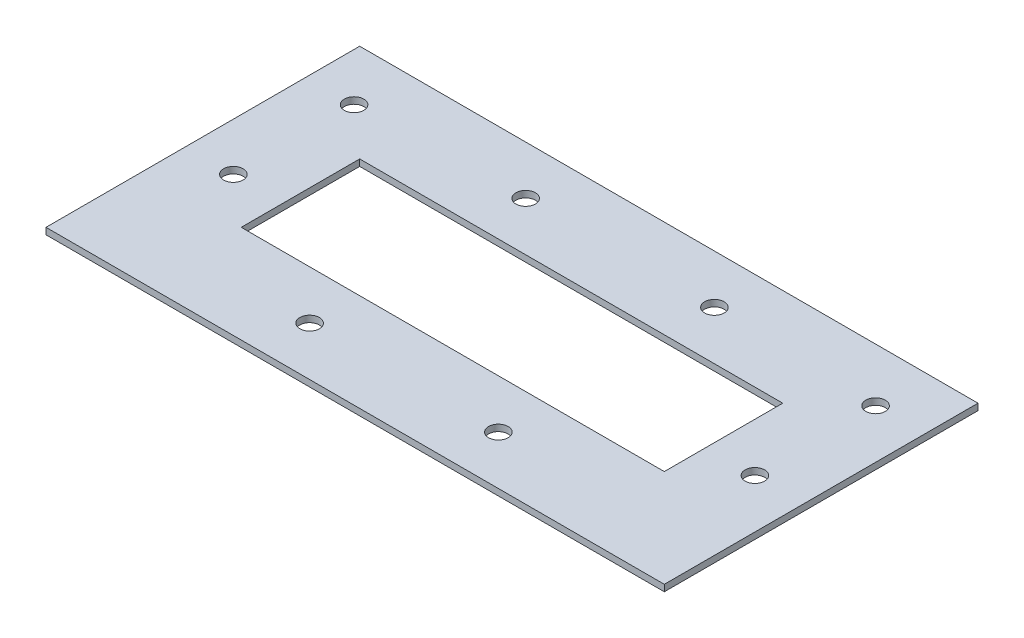
ISO-10303-21;
HEADER;
FILE_DESCRIPTION(('STEP AP214'),'2;1');
FILE_NAME('part.step','',(''),(''),'','','');
FILE_SCHEMA(('AUTOMOTIVE_DESIGN { 1 0 10303 214 1 1 1 1 }'));
ENDSEC;
DATA;
#1=APPLICATION_CONTEXT('core data for automotive mechanical design processes');
#2=APPLICATION_PROTOCOL_DEFINITION('international standard','automotive_design',2000,#1);
#3=PRODUCT_CONTEXT('',#1,'mechanical');
#4=PRODUCT('Part','Part','',(#3));
#5=PRODUCT_RELATED_PRODUCT_CATEGORY('part','',(#4));
#6=PRODUCT_DEFINITION_FORMATION('','',#4);
#7=PRODUCT_DEFINITION_CONTEXT('part definition',#1,'design');
#8=PRODUCT_DEFINITION('design','',#6,#7);
#9=PRODUCT_DEFINITION_SHAPE('','',#8);
#10=(LENGTH_UNIT() NAMED_UNIT(*) SI_UNIT(.MILLI.,.METRE.));
#11=(NAMED_UNIT(*) PLANE_ANGLE_UNIT() SI_UNIT($,.RADIAN.));
#12=(NAMED_UNIT(*) SI_UNIT($,.STERADIAN.) SOLID_ANGLE_UNIT());
#13=UNCERTAINTY_MEASURE_WITH_UNIT(LENGTH_MEASURE(1.E-05),#10,'distance_accuracy_value','');
#14=(GEOMETRIC_REPRESENTATION_CONTEXT(3) GLOBAL_UNCERTAINTY_ASSIGNED_CONTEXT((#13)) GLOBAL_UNIT_ASSIGNED_CONTEXT((#10,
#11,#12)) REPRESENTATION_CONTEXT('',''));
#15=CARTESIAN_POINT('',(0.,0.,0.));
#16=DIRECTION('',(0.,0.,1.));
#17=DIRECTION('',(1.,0.,0.));
#18=AXIS2_PLACEMENT_3D('',#15,#16,#17);
#19=CARTESIAN_POINT('',(0.,1.,0.));
#20=DIRECTION('',(0.,-1.,0.));
#21=DIRECTION('',(0.,0.,-1.));
#22=AXIS2_PLACEMENT_3D('',#19,#20,#21);
#23=PLANE('',#22);
#24=DIRECTION('',(0.,0.,-1.));
#25=VECTOR('',#24,1.);
#26=CARTESIAN_POINT('',(47.499999996,1.,24.098680149));
#27=LINE('',#26,#25);
#28=CARTESIAN_POINT('',(47.499999996,1.,24.098680149));
#29=VERTEX_POINT('',#28);
#30=CARTESIAN_POINT('',(47.499999996,1.,-24.098680149));
#31=VERTEX_POINT('',#30);
#32=EDGE_CURVE('E138',#29,#31,#27,.T.);
#33=ORIENTED_EDGE('',*,*,#32,.T.);
#34=DIRECTION('',(-1.,0.,0.));
#35=VECTOR('',#34,1.);
#36=CARTESIAN_POINT('',(-47.499999996,1.,-24.098680149));
#37=LINE('',#36,#35);
#38=CARTESIAN_POINT('',(-47.499999996,1.,-24.098680149));
#39=VERTEX_POINT('',#38);
#40=EDGE_CURVE('E141',#31,#39,#37,.T.);
#41=ORIENTED_EDGE('',*,*,#40,.T.);
#42=DIRECTION('',(0.,0.,1.));
#43=VECTOR('',#42,1.);
#44=CARTESIAN_POINT('',(-47.499999996,1.,24.098680149));
#45=LINE('',#44,#43);
#46=CARTESIAN_POINT('',(-47.499999996,1.,24.098680149));
#47=VERTEX_POINT('',#46);
#48=EDGE_CURVE('E144',#39,#47,#45,.T.);
#49=ORIENTED_EDGE('',*,*,#48,.T.);
#50=DIRECTION('',(1.,0.,0.));
#51=VECTOR('',#50,1.);
#52=CARTESIAN_POINT('',(-47.499999996,1.,24.098680149));
#53=LINE('',#52,#51);
#54=EDGE_CURVE('E146',#47,#29,#53,.T.);
#55=ORIENTED_EDGE('',*,*,#54,.T.);
#56=EDGE_LOOP('',(#33,#41,#49,#55));
#57=FACE_BOUND('',#56,.T.);
#58=DIRECTION('',(0.,0.,-1.));
#59=VECTOR('',#58,1.);
#60=CARTESIAN_POINT('',(32.499999996,1.,9.09868014899999));
#61=LINE('',#60,#59);
#62=CARTESIAN_POINT('',(32.499999996,1.,9.09868014899999));
#63=VERTEX_POINT('',#62);
#64=CARTESIAN_POINT('',(32.499999996,1.,-9.09868014900001));
#65=VERTEX_POINT('',#64);
#66=EDGE_CURVE('E99',#63,#65,#61,.T.);
#67=ORIENTED_EDGE('',*,*,#66,.F.);
#68=DIRECTION('',(1.,0.,0.));
#69=VECTOR('',#68,1.);
#70=CARTESIAN_POINT('',(-32.499999996,1.,9.098680149));
#71=LINE('',#70,#69);
#72=CARTESIAN_POINT('',(-32.499999996,1.,9.098680149));
#73=VERTEX_POINT('',#72);
#74=EDGE_CURVE('E122',#73,#63,#71,.T.);
#75=ORIENTED_EDGE('',*,*,#74,.F.);
#76=DIRECTION('',(0.,0.,1.));
#77=VECTOR('',#76,1.);
#78=CARTESIAN_POINT('',(-32.499999996,1.,9.098680149));
#79=LINE('',#78,#77);
#80=CARTESIAN_POINT('',(-32.499999996,1.,-9.09868014900001));
#81=VERTEX_POINT('',#80);
#82=EDGE_CURVE('E120',#81,#73,#79,.T.);
#83=ORIENTED_EDGE('',*,*,#82,.F.);
#84=DIRECTION('',(-1.,0.,0.));
#85=VECTOR('',#84,1.);
#86=CARTESIAN_POINT('',(-32.499999996,1.,-9.09868014900001));
#87=LINE('',#86,#85);
#88=EDGE_CURVE('E107',#65,#81,#87,.T.);
#89=ORIENTED_EDGE('',*,*,#88,.F.);
#90=EDGE_LOOP('',(#67,#75,#83,#89));
#91=FACE_BOUND('',#90,.T.);
#92=CARTESIAN_POINT('',(-14.499999996,1.,-16.598680149));
#93=DIRECTION('',(0.,1.,0.));
#94=DIRECTION('',(0.,0.,1.));
#95=AXIS2_PLACEMENT_3D('',#92,#93,#94);
#96=CIRCLE('',#95,1.5);
#97=CARTESIAN_POINT('',(-14.499999996,1.,-15.098680149));
#98=VERTEX_POINT('',#97);
#99=EDGE_CURVE('E128',#98,#98,#96,.T.);
#100=ORIENTED_EDGE('',*,*,#99,.F.);
#101=EDGE_LOOP('',(#100));
#102=FACE_BOUND('',#101,.T.);
#103=CARTESIAN_POINT('',(14.499999996,1.,-16.598680149));
#104=DIRECTION('',(0.,1.,0.));
#105=DIRECTION('',(0.,0.,1.));
#106=AXIS2_PLACEMENT_3D('',#103,#104,#105);
#107=CIRCLE('',#106,1.5);
#108=CARTESIAN_POINT('',(14.499999996,1.,-15.098680149));
#109=VERTEX_POINT('',#108);
#110=EDGE_CURVE('E290',#109,#109,#107,.T.);
#111=ORIENTED_EDGE('',*,*,#110,.F.);
#112=EDGE_LOOP('',(#111));
#113=FACE_BOUND('',#112,.T.);
#114=CARTESIAN_POINT('',(-40.1489742278698,1.,-15.8817618874375));
#115=DIRECTION('',(0.,1.,0.));
#116=DIRECTION('',(0.,0.,1.));
#117=AXIS2_PLACEMENT_3D('',#114,#115,#116);
#118=CIRCLE('',#117,1.5);
#119=CARTESIAN_POINT('',(-40.1489742278698,1.,-14.3817618874374));
#120=VERTEX_POINT('',#119);
#121=EDGE_CURVE('E284',#120,#120,#118,.T.);
#122=ORIENTED_EDGE('',*,*,#121,.F.);
#123=EDGE_LOOP('',(#122));
#124=FACE_BOUND('',#123,.T.);
#125=CARTESIAN_POINT('',(-40.1489742278698,1.,2.662696696534));
#126=DIRECTION('',(0.,1.,0.));
#127=DIRECTION('',(0.,0.,1.));
#128=AXIS2_PLACEMENT_3D('',#125,#126,#127);
#129=CIRCLE('',#128,1.5);
#130=CARTESIAN_POINT('',(-40.1489742278698,1.,4.162696696534));
#131=VERTEX_POINT('',#130);
#132=EDGE_CURVE('E278',#131,#131,#129,.T.);
#133=ORIENTED_EDGE('',*,*,#132,.F.);
#134=EDGE_LOOP('',(#133));
#135=FACE_BOUND('',#134,.T.);
#136=CARTESIAN_POINT('',(39.9788527335526,1.,-15.8817618874375));
#137=DIRECTION('',(0.,1.,0.));
#138=DIRECTION('',(0.,0.,1.));
#139=AXIS2_PLACEMENT_3D('',#136,#137,#138);
#140=CIRCLE('',#139,1.5);
#141=CARTESIAN_POINT('',(39.9788527335526,1.,-14.3817618874374));
#142=VERTEX_POINT('',#141);
#143=EDGE_CURVE('E272',#142,#142,#140,.T.);
#144=ORIENTED_EDGE('',*,*,#143,.F.);
#145=EDGE_LOOP('',(#144));
#146=FACE_BOUND('',#145,.T.);
#147=CARTESIAN_POINT('',(39.9788527335526,1.,2.662696696534));
#148=DIRECTION('',(0.,1.,0.));
#149=DIRECTION('',(0.,0.,1.));
#150=AXIS2_PLACEMENT_3D('',#147,#148,#149);
#151=CIRCLE('',#150,1.5);
#152=CARTESIAN_POINT('',(39.9788527335526,1.,4.16269669653401));
#153=VERTEX_POINT('',#152);
#154=EDGE_CURVE('E266',#153,#153,#151,.T.);
#155=ORIENTED_EDGE('',*,*,#154,.F.);
#156=EDGE_LOOP('',(#155));
#157=FACE_BOUND('',#156,.T.);
#158=CARTESIAN_POINT('',(-14.499999996,1.,16.598680149));
#159=DIRECTION('',(0.,1.,0.));
#160=DIRECTION('',(0.,0.,1.));
#161=AXIS2_PLACEMENT_3D('',#158,#159,#160);
#162=CIRCLE('',#161,1.5);
#163=CARTESIAN_POINT('',(-14.499999996,1.,18.098680149));
#164=VERTEX_POINT('',#163);
#165=EDGE_CURVE('E260',#164,#164,#162,.T.);
#166=ORIENTED_EDGE('',*,*,#165,.F.);
#167=EDGE_LOOP('',(#166));
#168=FACE_BOUND('',#167,.T.);
#169=CARTESIAN_POINT('',(14.499999996,1.,16.598680149));
#170=DIRECTION('',(0.,1.,0.));
#171=DIRECTION('',(0.,0.,1.));
#172=AXIS2_PLACEMENT_3D('',#169,#170,#171);
#173=CIRCLE('',#172,1.5);
#174=CARTESIAN_POINT('',(14.499999996,1.,18.098680149));
#175=VERTEX_POINT('',#174);
#176=EDGE_CURVE('E251',#175,#175,#173,.T.);
#177=ORIENTED_EDGE('',*,*,#176,.F.);
#178=EDGE_LOOP('',(#177));
#179=FACE_BOUND('',#178,.T.);
#180=ADVANCED_FACE('F34',(#57,#91,#102,#113,#124,#135,#146,#157,#168,#179),#23,.F.);
#181=CARTESIAN_POINT('',(0.,0.,0.));
#182=DIRECTION('',(0.,-1.,0.));
#183=DIRECTION('',(0.,0.,-1.));
#184=AXIS2_PLACEMENT_3D('',#181,#182,#183);
#185=PLANE('',#184);
#186=CARTESIAN_POINT('',(-14.499999996,0.,16.598680149));
#187=DIRECTION('',(0.,1.,0.));
#188=DIRECTION('',(0.,0.,1.));
#189=AXIS2_PLACEMENT_3D('',#186,#187,#188);
#190=CIRCLE('',#189,1.5);
#191=CARTESIAN_POINT('',(-14.499999996,0.,18.098680149));
#192=VERTEX_POINT('',#191);
#193=EDGE_CURVE('E257',#192,#192,#190,.T.);
#194=ORIENTED_EDGE('',*,*,#193,.T.);
#195=EDGE_LOOP('',(#194));
#196=FACE_BOUND('',#195,.T.);
#197=CARTESIAN_POINT('',(39.9788527335526,0.,-15.8817618874375));
#198=DIRECTION('',(0.,1.,0.));
#199=DIRECTION('',(0.,0.,1.));
#200=AXIS2_PLACEMENT_3D('',#197,#198,#199);
#201=CIRCLE('',#200,1.5);
#202=CARTESIAN_POINT('',(39.9788527335526,0.,-14.3817618874374));
#203=VERTEX_POINT('',#202);
#204=EDGE_CURVE('E269',#203,#203,#201,.T.);
#205=ORIENTED_EDGE('',*,*,#204,.T.);
#206=EDGE_LOOP('',(#205));
#207=FACE_BOUND('',#206,.T.);
#208=CARTESIAN_POINT('',(-40.1489742278698,0.,-15.8817618874375));
#209=DIRECTION('',(0.,1.,0.));
#210=DIRECTION('',(0.,0.,1.));
#211=AXIS2_PLACEMENT_3D('',#208,#209,#210);
#212=CIRCLE('',#211,1.5);
#213=CARTESIAN_POINT('',(-40.1489742278698,0.,-14.3817618874374));
#214=VERTEX_POINT('',#213);
#215=EDGE_CURVE('E281',#214,#214,#212,.T.);
#216=ORIENTED_EDGE('',*,*,#215,.T.);
#217=EDGE_LOOP('',(#216));
#218=FACE_BOUND('',#217,.T.);
#219=CARTESIAN_POINT('',(-14.499999996,0.,-16.598680149));
#220=DIRECTION('',(0.,1.,0.));
#221=DIRECTION('',(0.,0.,1.));
#222=AXIS2_PLACEMENT_3D('',#219,#220,#221);
#223=CIRCLE('',#222,1.5);
#224=CARTESIAN_POINT('',(-14.499999996,0.,-15.098680149));
#225=VERTEX_POINT('',#224);
#226=EDGE_CURVE('E293',#225,#225,#223,.T.);
#227=ORIENTED_EDGE('',*,*,#226,.T.);
#228=EDGE_LOOP('',(#227));
#229=FACE_BOUND('',#228,.T.);
#230=DIRECTION('',(0.,0.,-1.));
#231=VECTOR('',#230,1.);
#232=CARTESIAN_POINT('',(47.499999996,0.,24.098680149));
#233=LINE('',#232,#231);
#234=CARTESIAN_POINT('',(47.499999996,0.,24.098680149));
#235=VERTEX_POINT('',#234);
#236=CARTESIAN_POINT('',(47.499999996,0.,-24.098680149));
#237=VERTEX_POINT('',#236);
#238=EDGE_CURVE('E115',#235,#237,#233,.T.);
#239=ORIENTED_EDGE('',*,*,#238,.F.);
#240=DIRECTION('',(1.,0.,0.));
#241=VECTOR('',#240,1.);
#242=CARTESIAN_POINT('',(-47.499999996,0.,24.098680149));
#243=LINE('',#242,#241);
#244=CARTESIAN_POINT('',(-47.499999996,0.,24.098680149));
#245=VERTEX_POINT('',#244);
#246=EDGE_CURVE('E142',#245,#235,#243,.T.);
#247=ORIENTED_EDGE('',*,*,#246,.F.);
#248=DIRECTION('',(0.,0.,1.));
#249=VECTOR('',#248,1.);
#250=CARTESIAN_POINT('',(-47.499999996,0.,24.098680149));
#251=LINE('',#250,#249);
#252=CARTESIAN_POINT('',(-47.499999996,0.,-24.098680149));
#253=VERTEX_POINT('',#252);
#254=EDGE_CURVE('E153',#253,#245,#251,.T.);
#255=ORIENTED_EDGE('',*,*,#254,.F.);
#256=DIRECTION('',(-1.,0.,0.));
#257=VECTOR('',#256,1.);
#258=CARTESIAN_POINT('',(-47.499999996,0.,-24.098680149));
#259=LINE('',#258,#257);
#260=EDGE_CURVE('E151',#237,#253,#259,.T.);
#261=ORIENTED_EDGE('',*,*,#260,.F.);
#262=EDGE_LOOP('',(#239,#247,#255,#261));
#263=FACE_BOUND('',#262,.T.);
#264=DIRECTION('',(1.,0.,0.));
#265=VECTOR('',#264,1.);
#266=CARTESIAN_POINT('',(-32.499999996,0.,9.098680149));
#267=LINE('',#266,#265);
#268=CARTESIAN_POINT('',(-32.499999996,0.,9.098680149));
#269=VERTEX_POINT('',#268);
#270=CARTESIAN_POINT('',(32.499999996,0.,9.09868014899999));
#271=VERTEX_POINT('',#270);
#272=EDGE_CURVE('E108',#269,#271,#267,.T.);
#273=ORIENTED_EDGE('',*,*,#272,.T.);
#274=DIRECTION('',(0.,0.,-1.));
#275=VECTOR('',#274,1.);
#276=CARTESIAN_POINT('',(32.499999996,0.,9.09868014899999));
#277=LINE('',#276,#275);
#278=CARTESIAN_POINT('',(32.499999996,0.,-9.09868014900001));
#279=VERTEX_POINT('',#278);
#280=EDGE_CURVE('E57',#271,#279,#277,.T.);
#281=ORIENTED_EDGE('',*,*,#280,.T.);
#282=DIRECTION('',(-1.,0.,0.));
#283=VECTOR('',#282,1.);
#284=CARTESIAN_POINT('',(-32.499999996,0.,-9.09868014900001));
#285=LINE('',#284,#283);
#286=CARTESIAN_POINT('',(-32.499999996,0.,-9.09868014900001));
#287=VERTEX_POINT('',#286);
#288=EDGE_CURVE('E114',#279,#287,#285,.T.);
#289=ORIENTED_EDGE('',*,*,#288,.T.);
#290=DIRECTION('',(0.,0.,1.));
#291=VECTOR('',#290,1.);
#292=CARTESIAN_POINT('',(-32.499999996,0.,9.098680149));
#293=LINE('',#292,#291);
#294=EDGE_CURVE('E130',#287,#269,#293,.T.);
#295=ORIENTED_EDGE('',*,*,#294,.T.);
#296=EDGE_LOOP('',(#273,#281,#289,#295));
#297=FACE_BOUND('',#296,.T.);
#298=CARTESIAN_POINT('',(14.499999996,0.,-16.598680149));
#299=DIRECTION('',(0.,1.,0.));
#300=DIRECTION('',(0.,0.,1.));
#301=AXIS2_PLACEMENT_3D('',#298,#299,#300);
#302=CIRCLE('',#301,1.5);
#303=CARTESIAN_POINT('',(14.499999996,0.,-15.098680149));
#304=VERTEX_POINT('',#303);
#305=EDGE_CURVE('E287',#304,#304,#302,.T.);
#306=ORIENTED_EDGE('',*,*,#305,.T.);
#307=EDGE_LOOP('',(#306));
#308=FACE_BOUND('',#307,.T.);
#309=CARTESIAN_POINT('',(-40.1489742278698,0.,2.662696696534));
#310=DIRECTION('',(0.,1.,0.));
#311=DIRECTION('',(0.,0.,1.));
#312=AXIS2_PLACEMENT_3D('',#309,#310,#311);
#313=CIRCLE('',#312,1.5);
#314=CARTESIAN_POINT('',(-40.1489742278698,0.,4.162696696534));
#315=VERTEX_POINT('',#314);
#316=EDGE_CURVE('E275',#315,#315,#313,.T.);
#317=ORIENTED_EDGE('',*,*,#316,.T.);
#318=EDGE_LOOP('',(#317));
#319=FACE_BOUND('',#318,.T.);
#320=CARTESIAN_POINT('',(39.9788527335526,0.,2.662696696534));
#321=DIRECTION('',(0.,1.,0.));
#322=DIRECTION('',(0.,0.,1.));
#323=AXIS2_PLACEMENT_3D('',#320,#321,#322);
#324=CIRCLE('',#323,1.5);
#325=CARTESIAN_POINT('',(39.9788527335526,0.,4.16269669653401));
#326=VERTEX_POINT('',#325);
#327=EDGE_CURVE('E263',#326,#326,#324,.T.);
#328=ORIENTED_EDGE('',*,*,#327,.T.);
#329=EDGE_LOOP('',(#328));
#330=FACE_BOUND('',#329,.T.);
#331=CARTESIAN_POINT('',(14.499999996,0.,16.598680149));
#332=DIRECTION('',(0.,1.,0.));
#333=DIRECTION('',(0.,0.,1.));
#334=AXIS2_PLACEMENT_3D('',#331,#332,#333);
#335=CIRCLE('',#334,1.5);
#336=CARTESIAN_POINT('',(14.499999996,0.,18.098680149));
#337=VERTEX_POINT('',#336);
#338=EDGE_CURVE('E254',#337,#337,#335,.T.);
#339=ORIENTED_EDGE('',*,*,#338,.T.);
#340=EDGE_LOOP('',(#339));
#341=FACE_BOUND('',#340,.T.);
#342=ADVANCED_FACE('F171',(#196,#207,#218,#229,#263,#297,#308,#319,#330,#341),#185,.T.);
#343=CARTESIAN_POINT('',(47.499999996,1.,24.098680149));
#344=DIRECTION('',(-1.,0.,0.));
#345=DIRECTION('',(0.,0.,1.));
#346=AXIS2_PLACEMENT_3D('',#343,#344,#345);
#347=PLANE('',#346);
#348=ORIENTED_EDGE('',*,*,#238,.T.);
#349=DIRECTION('',(0.,-1.,0.));
#350=VECTOR('',#349,1.);
#351=CARTESIAN_POINT('',(47.499999996,1.,-24.098680149));
#352=LINE('',#351,#350);
#353=EDGE_CURVE('E11',#31,#237,#352,.T.);
#354=ORIENTED_EDGE('',*,*,#353,.F.);
#355=ORIENTED_EDGE('',*,*,#32,.F.);
#356=DIRECTION('',(0.,-1.,0.));
#357=VECTOR('',#356,1.);
#358=CARTESIAN_POINT('',(47.499999996,1.,24.098680149));
#359=LINE('',#358,#357);
#360=EDGE_CURVE('E148',#29,#235,#359,.T.);
#361=ORIENTED_EDGE('',*,*,#360,.T.);
#362=EDGE_LOOP('',(#348,#354,#355,#361));
#363=FACE_BOUND('',#362,.T.);
#364=ADVANCED_FACE('F36',(#363),#347,.F.);
#365=CARTESIAN_POINT('',(-47.499999996,1.,-24.098680149));
#366=DIRECTION('',(0.,0.,1.));
#367=DIRECTION('',(1.,0.,0.));
#368=AXIS2_PLACEMENT_3D('',#365,#366,#367);
#369=PLANE('',#368);
#370=ORIENTED_EDGE('',*,*,#260,.T.);
#371=DIRECTION('',(0.,-1.,0.));
#372=VECTOR('',#371,1.);
#373=CARTESIAN_POINT('',(-47.499999996,1.,-24.098680149));
#374=LINE('',#373,#372);
#375=EDGE_CURVE('E42',#39,#253,#374,.T.);
#376=ORIENTED_EDGE('',*,*,#375,.F.);
#377=ORIENTED_EDGE('',*,*,#40,.F.);
#378=ORIENTED_EDGE('',*,*,#353,.T.);
#379=EDGE_LOOP('',(#370,#376,#377,#378));
#380=FACE_BOUND('',#379,.T.);
#381=ADVANCED_FACE('F181',(#380),#369,.F.);
#382=CARTESIAN_POINT('',(-47.499999996,1.,24.098680149));
#383=DIRECTION('',(1.,0.,0.));
#384=DIRECTION('',(0.,0.,-1.));
#385=AXIS2_PLACEMENT_3D('',#382,#383,#384);
#386=PLANE('',#385);
#387=ORIENTED_EDGE('',*,*,#254,.T.);
#388=DIRECTION('',(0.,-1.,0.));
#389=VECTOR('',#388,1.);
#390=CARTESIAN_POINT('',(-47.499999996,1.,24.098680149));
#391=LINE('',#390,#389);
#392=EDGE_CURVE('E158',#47,#245,#391,.T.);
#393=ORIENTED_EDGE('',*,*,#392,.F.);
#394=ORIENTED_EDGE('',*,*,#48,.F.);
#395=ORIENTED_EDGE('',*,*,#375,.T.);
#396=EDGE_LOOP('',(#387,#393,#394,#395));
#397=FACE_BOUND('',#396,.T.);
#398=ADVANCED_FACE('F165',(#397),#386,.F.);
#399=CARTESIAN_POINT('',(-47.499999996,1.,24.098680149));
#400=DIRECTION('',(0.,0.,-1.));
#401=DIRECTION('',(-1.,0.,0.));
#402=AXIS2_PLACEMENT_3D('',#399,#400,#401);
#403=PLANE('',#402);
#404=ORIENTED_EDGE('',*,*,#246,.T.);
#405=ORIENTED_EDGE('',*,*,#360,.F.);
#406=ORIENTED_EDGE('',*,*,#54,.F.);
#407=ORIENTED_EDGE('',*,*,#392,.T.);
#408=EDGE_LOOP('',(#404,#405,#406,#407));
#409=FACE_BOUND('',#408,.T.);
#410=ADVANCED_FACE('F175',(#409),#403,.F.);
#411=CARTESIAN_POINT('',(32.499999996,1.,9.09868014899999));
#412=DIRECTION('',(-1.,0.,0.));
#413=DIRECTION('',(0.,0.,1.));
#414=AXIS2_PLACEMENT_3D('',#411,#412,#413);
#415=PLANE('',#414);
#416=ORIENTED_EDGE('',*,*,#280,.F.);
#417=DIRECTION('',(0.,-1.,0.));
#418=VECTOR('',#417,1.);
#419=CARTESIAN_POINT('',(32.499999996,1.,9.09868014899999));
#420=LINE('',#419,#418);
#421=EDGE_CURVE('E103',#63,#271,#420,.T.);
#422=ORIENTED_EDGE('',*,*,#421,.F.);
#423=ORIENTED_EDGE('',*,*,#66,.T.);
#424=DIRECTION('',(0.,-1.,0.));
#425=VECTOR('',#424,1.);
#426=CARTESIAN_POINT('',(32.499999996,1.,-9.09868014900001));
#427=LINE('',#426,#425);
#428=EDGE_CURVE('E102',#65,#279,#427,.T.);
#429=ORIENTED_EDGE('',*,*,#428,.T.);
#430=EDGE_LOOP('',(#416,#422,#423,#429));
#431=FACE_BOUND('',#430,.T.);
#432=ADVANCED_FACE('F101',(#431),#415,.T.);
#433=CARTESIAN_POINT('',(-32.499999996,1.,-9.09868014900001));
#434=DIRECTION('',(0.,0.,1.));
#435=DIRECTION('',(1.,0.,0.));
#436=AXIS2_PLACEMENT_3D('',#433,#434,#435);
#437=PLANE('',#436);
#438=ORIENTED_EDGE('',*,*,#288,.F.);
#439=ORIENTED_EDGE('',*,*,#428,.F.);
#440=ORIENTED_EDGE('',*,*,#88,.T.);
#441=DIRECTION('',(0.,-1.,0.));
#442=VECTOR('',#441,1.);
#443=CARTESIAN_POINT('',(-32.499999996,1.,-9.09868014900001));
#444=LINE('',#443,#442);
#445=EDGE_CURVE('E116',#81,#287,#444,.T.);
#446=ORIENTED_EDGE('',*,*,#445,.T.);
#447=EDGE_LOOP('',(#438,#439,#440,#446));
#448=FACE_BOUND('',#447,.T.);
#449=ADVANCED_FACE('F111',(#448),#437,.T.);
#450=CARTESIAN_POINT('',(-32.499999996,1.,9.098680149));
#451=DIRECTION('',(1.,0.,0.));
#452=DIRECTION('',(0.,0.,-1.));
#453=AXIS2_PLACEMENT_3D('',#450,#451,#452);
#454=PLANE('',#453);
#455=ORIENTED_EDGE('',*,*,#294,.F.);
#456=ORIENTED_EDGE('',*,*,#445,.F.);
#457=ORIENTED_EDGE('',*,*,#82,.T.);
#458=DIRECTION('',(0.,-1.,0.));
#459=VECTOR('',#458,1.);
#460=CARTESIAN_POINT('',(-32.499999996,1.,9.098680149));
#461=LINE('',#460,#459);
#462=EDGE_CURVE('E49',#73,#269,#461,.T.);
#463=ORIENTED_EDGE('',*,*,#462,.T.);
#464=EDGE_LOOP('',(#455,#456,#457,#463));
#465=FACE_BOUND('',#464,.T.);
#466=ADVANCED_FACE('F205',(#465),#454,.T.);
#467=CARTESIAN_POINT('',(-32.499999996,1.,9.098680149));
#468=DIRECTION('',(0.,0.,-1.));
#469=DIRECTION('',(-1.,0.,0.));
#470=AXIS2_PLACEMENT_3D('',#467,#468,#469);
#471=PLANE('',#470);
#472=ORIENTED_EDGE('',*,*,#272,.F.);
#473=ORIENTED_EDGE('',*,*,#462,.F.);
#474=ORIENTED_EDGE('',*,*,#74,.T.);
#475=ORIENTED_EDGE('',*,*,#421,.T.);
#476=EDGE_LOOP('',(#472,#473,#474,#475));
#477=FACE_BOUND('',#476,.T.);
#478=ADVANCED_FACE('F209',(#477),#471,.T.);
#479=CARTESIAN_POINT('',(-14.499999996,1.,-16.598680149));
#480=DIRECTION('',(0.,-1.,0.));
#481=DIRECTION('',(0.,0.,-1.));
#482=AXIS2_PLACEMENT_3D('',#479,#480,#481);
#483=CYLINDRICAL_SURFACE('',#482,1.5);
#484=ORIENTED_EDGE('',*,*,#99,.T.);
#485=EDGE_LOOP('',(#484));
#486=FACE_BOUND('',#485,.T.);
#487=ORIENTED_EDGE('',*,*,#226,.F.);
#488=EDGE_LOOP('',(#487));
#489=FACE_BOUND('',#488,.T.);
#490=ADVANCED_FACE('F215',(#486,#489),#483,.F.);
#491=CARTESIAN_POINT('',(14.499999996,1.,-16.598680149));
#492=DIRECTION('',(0.,-1.,0.));
#493=DIRECTION('',(0.,0.,-1.));
#494=AXIS2_PLACEMENT_3D('',#491,#492,#493);
#495=CYLINDRICAL_SURFACE('',#494,1.5);
#496=ORIENTED_EDGE('',*,*,#110,.T.);
#497=EDGE_LOOP('',(#496));
#498=FACE_BOUND('',#497,.T.);
#499=ORIENTED_EDGE('',*,*,#305,.F.);
#500=EDGE_LOOP('',(#499));
#501=FACE_BOUND('',#500,.T.);
#502=ADVANCED_FACE('F218',(#498,#501),#495,.F.);
#503=CARTESIAN_POINT('',(-40.1489742278698,1.,-15.8817618874375));
#504=DIRECTION('',(0.,-1.,0.));
#505=DIRECTION('',(0.,0.,-1.));
#506=AXIS2_PLACEMENT_3D('',#503,#504,#505);
#507=CYLINDRICAL_SURFACE('',#506,1.5);
#508=ORIENTED_EDGE('',*,*,#121,.T.);
#509=EDGE_LOOP('',(#508));
#510=FACE_BOUND('',#509,.T.);
#511=ORIENTED_EDGE('',*,*,#215,.F.);
#512=EDGE_LOOP('',(#511));
#513=FACE_BOUND('',#512,.T.);
#514=ADVANCED_FACE('F222',(#510,#513),#507,.F.);
#515=CARTESIAN_POINT('',(-40.1489742278698,1.,2.662696696534));
#516=DIRECTION('',(0.,-1.,0.));
#517=DIRECTION('',(0.,0.,-1.));
#518=AXIS2_PLACEMENT_3D('',#515,#516,#517);
#519=CYLINDRICAL_SURFACE('',#518,1.5);
#520=ORIENTED_EDGE('',*,*,#132,.T.);
#521=EDGE_LOOP('',(#520));
#522=FACE_BOUND('',#521,.T.);
#523=ORIENTED_EDGE('',*,*,#316,.F.);
#524=EDGE_LOOP('',(#523));
#525=FACE_BOUND('',#524,.T.);
#526=ADVANCED_FACE('F226',(#522,#525),#519,.F.);
#527=CARTESIAN_POINT('',(39.9788527335526,1.,-15.8817618874375));
#528=DIRECTION('',(0.,-1.,0.));
#529=DIRECTION('',(0.,0.,-1.));
#530=AXIS2_PLACEMENT_3D('',#527,#528,#529);
#531=CYLINDRICAL_SURFACE('',#530,1.5);
#532=ORIENTED_EDGE('',*,*,#143,.T.);
#533=EDGE_LOOP('',(#532));
#534=FACE_BOUND('',#533,.T.);
#535=ORIENTED_EDGE('',*,*,#204,.F.);
#536=EDGE_LOOP('',(#535));
#537=FACE_BOUND('',#536,.T.);
#538=ADVANCED_FACE('F230',(#534,#537),#531,.F.);
#539=CARTESIAN_POINT('',(39.9788527335526,1.,2.662696696534));
#540=DIRECTION('',(0.,-1.,0.));
#541=DIRECTION('',(0.,0.,-1.));
#542=AXIS2_PLACEMENT_3D('',#539,#540,#541);
#543=CYLINDRICAL_SURFACE('',#542,1.5);
#544=ORIENTED_EDGE('',*,*,#154,.T.);
#545=EDGE_LOOP('',(#544));
#546=FACE_BOUND('',#545,.T.);
#547=ORIENTED_EDGE('',*,*,#327,.F.);
#548=EDGE_LOOP('',(#547));
#549=FACE_BOUND('',#548,.T.);
#550=ADVANCED_FACE('F234',(#546,#549),#543,.F.);
#551=CARTESIAN_POINT('',(-14.499999996,1.,16.598680149));
#552=DIRECTION('',(0.,-1.,0.));
#553=DIRECTION('',(0.,0.,-1.));
#554=AXIS2_PLACEMENT_3D('',#551,#552,#553);
#555=CYLINDRICAL_SURFACE('',#554,1.5);
#556=ORIENTED_EDGE('',*,*,#165,.T.);
#557=EDGE_LOOP('',(#556));
#558=FACE_BOUND('',#557,.T.);
#559=ORIENTED_EDGE('',*,*,#193,.F.);
#560=EDGE_LOOP('',(#559));
#561=FACE_BOUND('',#560,.T.);
#562=ADVANCED_FACE('F238',(#558,#561),#555,.F.);
#563=CARTESIAN_POINT('',(14.499999996,1.,16.598680149));
#564=DIRECTION('',(0.,-1.,0.));
#565=DIRECTION('',(0.,0.,-1.));
#566=AXIS2_PLACEMENT_3D('',#563,#564,#565);
#567=CYLINDRICAL_SURFACE('',#566,1.5);
#568=ORIENTED_EDGE('',*,*,#176,.T.);
#569=EDGE_LOOP('',(#568));
#570=FACE_BOUND('',#569,.T.);
#571=ORIENTED_EDGE('',*,*,#338,.F.);
#572=EDGE_LOOP('',(#571));
#573=FACE_BOUND('',#572,.T.);
#574=ADVANCED_FACE('F242',(#570,#573),#567,.F.);
#575=CLOSED_SHELL('',(#180,#342,#364,#381,#398,#410,#432,#449,#466,#478,#490,#502,#514,#526,
#538,#550,#562,#574));
#576=MANIFOLD_SOLID_BREP('B2',#575);
#577=ADVANCED_BREP_SHAPE_REPRESENTATION('',(#18,#576),#14);
#578=SHAPE_DEFINITION_REPRESENTATION(#9,#577);
ENDSEC;
END-ISO-10303-21;
